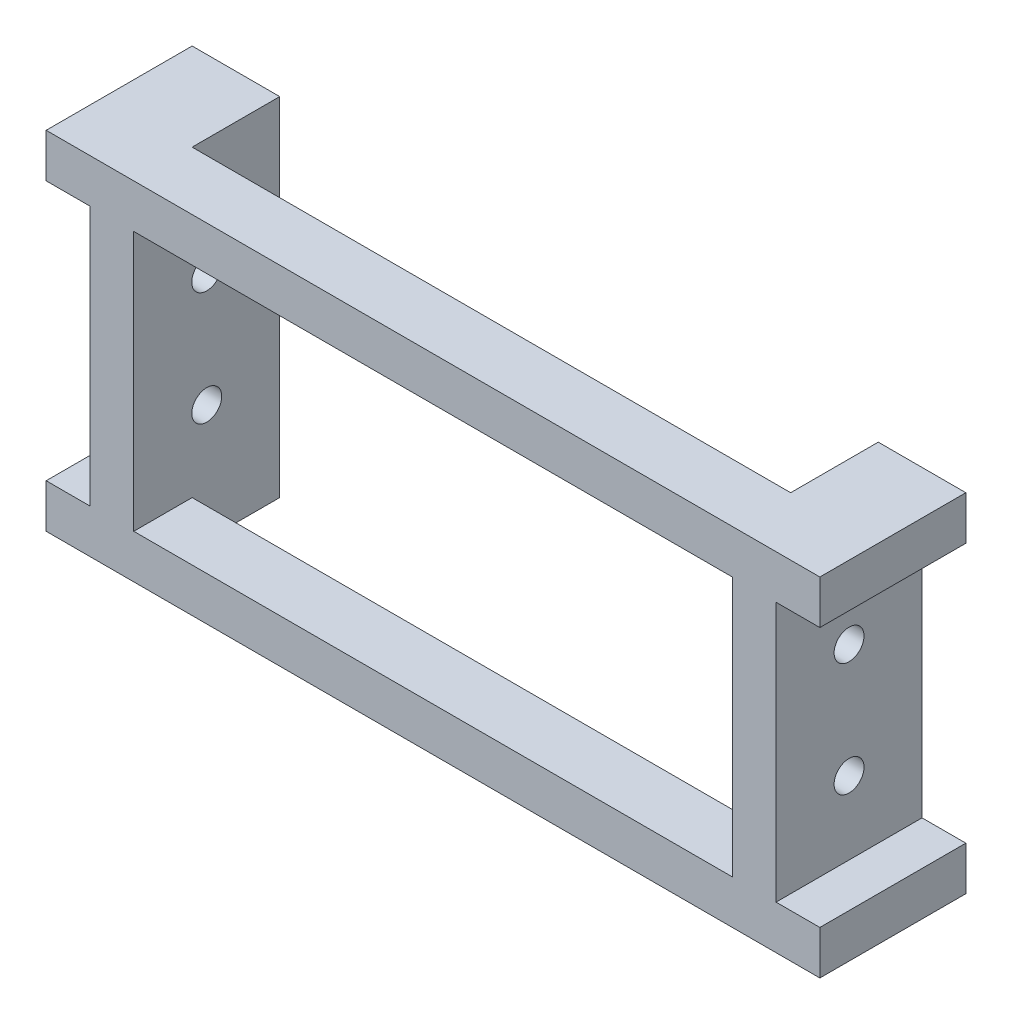
ISO-10303-21;
HEADER;
FILE_DESCRIPTION(('STEP AP214'),'2;1');
FILE_NAME('part.step','',(''),(''),'','','');
FILE_SCHEMA(('AUTOMOTIVE_DESIGN { 1 0 10303 214 1 1 1 1 }'));
ENDSEC;
DATA;
#1=APPLICATION_CONTEXT('core data for automotive mechanical design processes');
#2=APPLICATION_PROTOCOL_DEFINITION('international standard','automotive_design',2000,#1);
#3=PRODUCT_CONTEXT('',#1,'mechanical');
#4=PRODUCT('Part','Part','',(#3));
#5=PRODUCT_RELATED_PRODUCT_CATEGORY('part','',(#4));
#6=PRODUCT_DEFINITION_FORMATION('','',#4);
#7=PRODUCT_DEFINITION_CONTEXT('part definition',#1,'design');
#8=PRODUCT_DEFINITION('design','',#6,#7);
#9=PRODUCT_DEFINITION_SHAPE('','',#8);
#10=(LENGTH_UNIT() NAMED_UNIT(*) SI_UNIT(.MILLI.,.METRE.));
#11=(NAMED_UNIT(*) PLANE_ANGLE_UNIT() SI_UNIT($,.RADIAN.));
#12=(NAMED_UNIT(*) SI_UNIT($,.STERADIAN.) SOLID_ANGLE_UNIT());
#13=UNCERTAINTY_MEASURE_WITH_UNIT(LENGTH_MEASURE(1.E-05),#10,'distance_accuracy_value','');
#14=(GEOMETRIC_REPRESENTATION_CONTEXT(3) GLOBAL_UNCERTAINTY_ASSIGNED_CONTEXT((#13)) GLOBAL_UNIT_ASSIGNED_CONTEXT((#10,
#11,#12)) REPRESENTATION_CONTEXT('',''));
#15=CARTESIAN_POINT('',(0.,0.,0.));
#16=DIRECTION('',(0.,0.,1.));
#17=DIRECTION('',(1.,0.,0.));
#18=AXIS2_PLACEMENT_3D('',#15,#16,#17);
#19=CARTESIAN_POINT('',(-37.7183154819464,9.55195891387468,0.));
#20=DIRECTION('',(0.,0.,1.));
#21=DIRECTION('',(1.,0.,0.));
#22=AXIS2_PLACEMENT_3D('',#19,#20,#21);
#23=PLANE('',#22);
#24=DIRECTION('',(-1.,0.,0.));
#25=VECTOR('',#24,1.);
#26=CARTESIAN_POINT('',(-37.7183154819464,12.5519589138747,0.));
#27=LINE('',#26,#25);
#28=CARTESIAN_POINT('',(-31.7183154819464,12.5519589138747,0.));
#29=VERTEX_POINT('',#28);
#30=CARTESIAN_POINT('',(-37.7183154819464,12.5519589138747,0.));
#31=VERTEX_POINT('',#30);
#32=EDGE_CURVE('E314',#29,#31,#27,.T.);
#33=ORIENTED_EDGE('',*,*,#32,.F.);
#34=DIRECTION('',(0.,-1.,0.));
#35=VECTOR('',#34,1.);
#36=CARTESIAN_POINT('',(-31.7183154819464,9.55195891387468,0.));
#37=LINE('',#36,#35);
#38=CARTESIAN_POINT('',(-31.7183154819464,-11.2380410861253,0.));
#39=VERTEX_POINT('',#38);
#40=EDGE_CURVE('E182',#29,#39,#37,.T.);
#41=ORIENTED_EDGE('',*,*,#40,.T.);
#42=DIRECTION('',(1.,0.,0.));
#43=VECTOR('',#42,1.);
#44=CARTESIAN_POINT('',(-37.7183154819464,-11.2380410861253,0.));
#45=LINE('',#44,#43);
#46=CARTESIAN_POINT('',(-37.7183154819464,-11.2380410861253,0.));
#47=VERTEX_POINT('',#46);
#48=EDGE_CURVE('E301',#47,#39,#45,.T.);
#49=ORIENTED_EDGE('',*,*,#48,.F.);
#50=DIRECTION('',(0.,-1.,0.));
#51=VECTOR('',#50,1.);
#52=CARTESIAN_POINT('',(-37.7183154819464,-8.23804108612532,0.));
#53=LINE('',#52,#51);
#54=CARTESIAN_POINT('',(-37.7183154819464,-8.23804108612532,0.));
#55=VERTEX_POINT('',#54);
#56=EDGE_CURVE('E298',#55,#47,#53,.T.);
#57=ORIENTED_EDGE('',*,*,#56,.F.);
#58=DIRECTION('',(-1.,0.,0.));
#59=VECTOR('',#58,1.);
#60=CARTESIAN_POINT('',(-37.7183154819464,-8.23804108612532,0.));
#61=LINE('',#60,#59);
#62=CARTESIAN_POINT('',(-34.7183154819464,-8.23804108612532,0.));
#63=VERTEX_POINT('',#62);
#64=EDGE_CURVE('E296',#63,#55,#61,.T.);
#65=ORIENTED_EDGE('',*,*,#64,.F.);
#66=DIRECTION('',(0.,-1.,0.));
#67=VECTOR('',#66,1.);
#68=CARTESIAN_POINT('',(-34.7183154819464,9.55195891387468,0.));
#69=LINE('',#68,#67);
#70=CARTESIAN_POINT('',(-34.7183154819464,9.55195891387468,0.));
#71=VERTEX_POINT('',#70);
#72=EDGE_CURVE('E294',#71,#63,#69,.T.);
#73=ORIENTED_EDGE('',*,*,#72,.F.);
#74=DIRECTION('',(1.,0.,0.));
#75=VECTOR('',#74,1.);
#76=CARTESIAN_POINT('',(-37.7183154819464,9.55195891387468,0.));
#77=LINE('',#76,#75);
#78=CARTESIAN_POINT('',(-37.7183154819464,9.55195891387468,0.));
#79=VERTEX_POINT('',#78);
#80=EDGE_CURVE('E292',#79,#71,#77,.T.);
#81=ORIENTED_EDGE('',*,*,#80,.F.);
#82=DIRECTION('',(0.,-1.,0.));
#83=VECTOR('',#82,1.);
#84=CARTESIAN_POINT('',(-37.7183154819464,12.5519589138747,0.));
#85=LINE('',#84,#83);
#86=EDGE_CURVE('E262',#31,#79,#85,.T.);
#87=ORIENTED_EDGE('',*,*,#86,.F.);
#88=EDGE_LOOP('',(#33,#41,#49,#57,#65,#73,#81,#87));
#89=FACE_BOUND('',#88,.T.);
#90=ADVANCED_FACE('F37',(#89),#23,.F.);
#91=DIRECTION('',(0.,1.,0.));
#92=VECTOR('',#91,1.);
#93=CARTESIAN_POINT('',(9.28168451805363,9.55195891387468,0.));
#94=LINE('',#93,#92);
#95=CARTESIAN_POINT('',(9.28168451805363,-11.2380410861253,0.));
#96=VERTEX_POINT('',#95);
#97=CARTESIAN_POINT('',(9.28168451805363,12.5519589138747,0.));
#98=VERTEX_POINT('',#97);
#99=EDGE_CURVE('E245',#96,#98,#94,.T.);
#100=ORIENTED_EDGE('',*,*,#99,.T.);
#101=CARTESIAN_POINT('',(15.2816845180536,12.5519589138747,0.));
#102=VERTEX_POINT('',#101);
#103=EDGE_CURVE('E267',#102,#98,#27,.T.);
#104=ORIENTED_EDGE('',*,*,#103,.F.);
#105=DIRECTION('',(0.,1.,0.));
#106=VECTOR('',#105,1.);
#107=CARTESIAN_POINT('',(15.2816845180536,9.55195891387468,0.));
#108=LINE('',#107,#106);
#109=CARTESIAN_POINT('',(15.2816845180536,9.55195891387468,0.));
#110=VERTEX_POINT('',#109);
#111=EDGE_CURVE('E312',#110,#102,#108,.T.);
#112=ORIENTED_EDGE('',*,*,#111,.F.);
#113=DIRECTION('',(1.,0.,0.));
#114=VECTOR('',#113,1.);
#115=CARTESIAN_POINT('',(12.2816845180536,9.55195891387468,0.));
#116=LINE('',#115,#114);
#117=CARTESIAN_POINT('',(12.2816845180536,9.55195891387468,0.));
#118=VERTEX_POINT('',#117);
#119=EDGE_CURVE('E310',#118,#110,#116,.T.);
#120=ORIENTED_EDGE('',*,*,#119,.F.);
#121=DIRECTION('',(0.,1.,0.));
#122=VECTOR('',#121,1.);
#123=CARTESIAN_POINT('',(12.2816845180536,9.55195891387468,0.));
#124=LINE('',#123,#122);
#125=CARTESIAN_POINT('',(12.2816845180536,-8.23804108612532,0.));
#126=VERTEX_POINT('',#125);
#127=EDGE_CURVE('E308',#126,#118,#124,.T.);
#128=ORIENTED_EDGE('',*,*,#127,.F.);
#129=DIRECTION('',(-1.,0.,0.));
#130=VECTOR('',#129,1.);
#131=CARTESIAN_POINT('',(15.2816845180536,-8.23804108612532,0.));
#132=LINE('',#131,#130);
#133=CARTESIAN_POINT('',(15.2816845180536,-8.23804108612532,0.));
#134=VERTEX_POINT('',#133);
#135=EDGE_CURVE('E306',#134,#126,#132,.T.);
#136=ORIENTED_EDGE('',*,*,#135,.F.);
#137=DIRECTION('',(0.,1.,0.));
#138=VECTOR('',#137,1.);
#139=CARTESIAN_POINT('',(15.2816845180536,-8.23804108612532,0.));
#140=LINE('',#139,#138);
#141=CARTESIAN_POINT('',(15.2816845180536,-11.2380410861253,0.));
#142=VERTEX_POINT('',#141);
#143=EDGE_CURVE('E304',#142,#134,#140,.T.);
#144=ORIENTED_EDGE('',*,*,#143,.F.);
#145=EDGE_CURVE('E300',#96,#142,#45,.T.);
#146=ORIENTED_EDGE('',*,*,#145,.F.);
#147=EDGE_LOOP('',(#100,#104,#112,#120,#128,#136,#144,#146));
#148=FACE_BOUND('',#147,.T.);
#149=ADVANCED_FACE('F386',(#148),#23,.F.);
#150=CARTESIAN_POINT('',(-37.7183154819464,12.5519589138747,10.));
#151=DIRECTION('',(0.,-1.,0.));
#152=DIRECTION('',(0.,0.,-1.));
#153=AXIS2_PLACEMENT_3D('',#150,#151,#152);
#154=PLANE('',#153);
#155=DIRECTION('',(0.,0.,-1.));
#156=VECTOR('',#155,1.);
#157=CARTESIAN_POINT('',(-31.7183154819464,12.5519589138747,6.));
#158=LINE('',#157,#156);
#159=CARTESIAN_POINT('',(-31.7183154819464,12.5519589138747,6.));
#160=VERTEX_POINT('',#159);
#161=EDGE_CURVE('E175',#160,#29,#158,.T.);
#162=ORIENTED_EDGE('',*,*,#161,.T.);
#163=ORIENTED_EDGE('',*,*,#32,.T.);
#164=DIRECTION('',(0.,0.,-1.));
#165=VECTOR('',#164,1.);
#166=CARTESIAN_POINT('',(-37.7183154819464,12.5519589138747,10.));
#167=LINE('',#166,#165);
#168=CARTESIAN_POINT('',(-37.7183154819464,12.5519589138747,10.));
#169=VERTEX_POINT('',#168);
#170=EDGE_CURVE('E289',#169,#31,#167,.T.);
#171=ORIENTED_EDGE('',*,*,#170,.F.);
#172=DIRECTION('',(-1.,0.,0.));
#173=VECTOR('',#172,1.);
#174=CARTESIAN_POINT('',(-37.7183154819464,12.5519589138747,10.));
#175=LINE('',#174,#173);
#176=CARTESIAN_POINT('',(15.2816845180536,12.5519589138747,10.));
#177=VERTEX_POINT('',#176);
#178=EDGE_CURVE('E287',#177,#169,#175,.T.);
#179=ORIENTED_EDGE('',*,*,#178,.F.);
#180=DIRECTION('',(0.,0.,-1.));
#181=VECTOR('',#180,1.);
#182=CARTESIAN_POINT('',(15.2816845180536,12.5519589138747,10.));
#183=LINE('',#182,#181);
#184=EDGE_CURVE('E318',#177,#102,#183,.T.);
#185=ORIENTED_EDGE('',*,*,#184,.T.);
#186=ORIENTED_EDGE('',*,*,#103,.T.);
#187=DIRECTION('',(0.,0.,-1.));
#188=VECTOR('',#187,1.);
#189=CARTESIAN_POINT('',(9.28168451805363,12.5519589138747,6.));
#190=LINE('',#189,#188);
#191=CARTESIAN_POINT('',(9.28168451805363,12.5519589138747,6.));
#192=VERTEX_POINT('',#191);
#193=EDGE_CURVE('E186',#192,#98,#190,.T.);
#194=ORIENTED_EDGE('',*,*,#193,.F.);
#195=DIRECTION('',(-1.,0.,0.));
#196=VECTOR('',#195,1.);
#197=CARTESIAN_POINT('',(-31.7183154819464,12.5519589138747,6.));
#198=LINE('',#197,#196);
#199=EDGE_CURVE('E192',#192,#160,#198,.T.);
#200=ORIENTED_EDGE('',*,*,#199,.T.);
#201=EDGE_LOOP('',(#162,#163,#171,#179,#185,#186,#194,#200));
#202=FACE_BOUND('',#201,.T.);
#203=ADVANCED_FACE('F196',(#202),#154,.F.);
#204=CARTESIAN_POINT('',(-37.7183154819464,9.55195891387468,10.));
#205=DIRECTION('',(0.,0.,1.));
#206=DIRECTION('',(1.,0.,0.));
#207=AXIS2_PLACEMENT_3D('',#204,#205,#206);
#208=PLANE('',#207);
#209=DIRECTION('',(0.,-1.,0.));
#210=VECTOR('',#209,1.);
#211=CARTESIAN_POINT('',(-37.7183154819464,12.5519589138747,10.));
#212=LINE('',#211,#210);
#213=CARTESIAN_POINT('',(-37.7183154819464,9.55195891387468,10.));
#214=VERTEX_POINT('',#213);
#215=EDGE_CURVE('E263',#169,#214,#212,.T.);
#216=ORIENTED_EDGE('',*,*,#215,.T.);
#217=DIRECTION('',(1.,0.,0.));
#218=VECTOR('',#217,1.);
#219=CARTESIAN_POINT('',(-37.7183154819464,9.55195891387468,10.));
#220=LINE('',#219,#218);
#221=CARTESIAN_POINT('',(-34.7183154819464,9.55195891387468,10.));
#222=VERTEX_POINT('',#221);
#223=EDGE_CURVE('E266',#214,#222,#220,.T.);
#224=ORIENTED_EDGE('',*,*,#223,.T.);
#225=DIRECTION('',(0.,-1.,0.));
#226=VECTOR('',#225,1.);
#227=CARTESIAN_POINT('',(-34.7183154819464,9.55195891387468,10.));
#228=LINE('',#227,#226);
#229=CARTESIAN_POINT('',(-34.7183154819464,-8.23804108612532,10.));
#230=VERTEX_POINT('',#229);
#231=EDGE_CURVE('E269',#222,#230,#228,.T.);
#232=ORIENTED_EDGE('',*,*,#231,.T.);
#233=DIRECTION('',(-1.,0.,0.));
#234=VECTOR('',#233,1.);
#235=CARTESIAN_POINT('',(-37.7183154819464,-8.23804108612532,10.));
#236=LINE('',#235,#234);
#237=CARTESIAN_POINT('',(-37.7183154819464,-8.23804108612532,10.));
#238=VERTEX_POINT('',#237);
#239=EDGE_CURVE('E271',#230,#238,#236,.T.);
#240=ORIENTED_EDGE('',*,*,#239,.T.);
#241=DIRECTION('',(0.,-1.,0.));
#242=VECTOR('',#241,1.);
#243=CARTESIAN_POINT('',(-37.7183154819464,-8.23804108612532,10.));
#244=LINE('',#243,#242);
#245=CARTESIAN_POINT('',(-37.7183154819464,-11.2380410861253,10.));
#246=VERTEX_POINT('',#245);
#247=EDGE_CURVE('E273',#238,#246,#244,.T.);
#248=ORIENTED_EDGE('',*,*,#247,.T.);
#249=DIRECTION('',(1.,0.,0.));
#250=VECTOR('',#249,1.);
#251=CARTESIAN_POINT('',(-37.7183154819464,-11.2380410861253,10.));
#252=LINE('',#251,#250);
#253=CARTESIAN_POINT('',(15.2816845180536,-11.2380410861253,10.));
#254=VERTEX_POINT('',#253);
#255=EDGE_CURVE('E275',#246,#254,#252,.T.);
#256=ORIENTED_EDGE('',*,*,#255,.T.);
#257=DIRECTION('',(0.,1.,0.));
#258=VECTOR('',#257,1.);
#259=CARTESIAN_POINT('',(15.2816845180536,-8.23804108612532,10.));
#260=LINE('',#259,#258);
#261=CARTESIAN_POINT('',(15.2816845180536,-8.23804108612532,10.));
#262=VERTEX_POINT('',#261);
#263=EDGE_CURVE('E277',#254,#262,#260,.T.);
#264=ORIENTED_EDGE('',*,*,#263,.T.);
#265=DIRECTION('',(-1.,0.,0.));
#266=VECTOR('',#265,1.);
#267=CARTESIAN_POINT('',(15.2816845180536,-8.23804108612532,10.));
#268=LINE('',#267,#266);
#269=CARTESIAN_POINT('',(12.2816845180536,-8.23804108612532,10.));
#270=VERTEX_POINT('',#269);
#271=EDGE_CURVE('E279',#262,#270,#268,.T.);
#272=ORIENTED_EDGE('',*,*,#271,.T.);
#273=DIRECTION('',(0.,1.,0.));
#274=VECTOR('',#273,1.);
#275=CARTESIAN_POINT('',(12.2816845180536,9.55195891387468,10.));
#276=LINE('',#275,#274);
#277=CARTESIAN_POINT('',(12.2816845180536,9.55195891387468,10.));
#278=VERTEX_POINT('',#277);
#279=EDGE_CURVE('E281',#270,#278,#276,.T.);
#280=ORIENTED_EDGE('',*,*,#279,.T.);
#281=DIRECTION('',(1.,0.,0.));
#282=VECTOR('',#281,1.);
#283=CARTESIAN_POINT('',(12.2816845180536,9.55195891387468,10.));
#284=LINE('',#283,#282);
#285=CARTESIAN_POINT('',(15.2816845180536,9.55195891387468,10.));
#286=VERTEX_POINT('',#285);
#287=EDGE_CURVE('E283',#278,#286,#284,.T.);
#288=ORIENTED_EDGE('',*,*,#287,.T.);
#289=DIRECTION('',(0.,1.,0.));
#290=VECTOR('',#289,1.);
#291=CARTESIAN_POINT('',(15.2816845180536,9.55195891387468,10.));
#292=LINE('',#291,#290);
#293=EDGE_CURVE('E285',#286,#177,#292,.T.);
#294=ORIENTED_EDGE('',*,*,#293,.T.);
#295=ORIENTED_EDGE('',*,*,#178,.T.);
#296=EDGE_LOOP('',(#216,#224,#232,#240,#248,#256,#264,#272,#280,#288,#294,#295));
#297=FACE_BOUND('',#296,.T.);
#298=DIRECTION('',(0.,-1.,0.));
#299=VECTOR('',#298,1.);
#300=CARTESIAN_POINT('',(-31.7183154819464,9.55195891387468,10.));
#301=LINE('',#300,#299);
#302=CARTESIAN_POINT('',(-31.7183154819464,9.55195891387468,10.));
#303=VERTEX_POINT('',#302);
#304=CARTESIAN_POINT('',(-31.7183154819464,-8.23804108612532,10.));
#305=VERTEX_POINT('',#304);
#306=EDGE_CURVE('E244',#303,#305,#301,.T.);
#307=ORIENTED_EDGE('',*,*,#306,.F.);
#308=DIRECTION('',(-1.,0.,0.));
#309=VECTOR('',#308,1.);
#310=CARTESIAN_POINT('',(-31.7183154819464,9.55195891387468,10.));
#311=LINE('',#310,#309);
#312=CARTESIAN_POINT('',(9.28168451805363,9.55195891387468,10.));
#313=VERTEX_POINT('',#312);
#314=EDGE_CURVE('E242',#313,#303,#311,.T.);
#315=ORIENTED_EDGE('',*,*,#314,.F.);
#316=DIRECTION('',(0.,1.,0.));
#317=VECTOR('',#316,1.);
#318=CARTESIAN_POINT('',(9.28168451805363,9.55195891387468,10.));
#319=LINE('',#318,#317);
#320=CARTESIAN_POINT('',(9.28168451805363,-8.23804108612532,10.));
#321=VERTEX_POINT('',#320);
#322=EDGE_CURVE('E249',#321,#313,#319,.T.);
#323=ORIENTED_EDGE('',*,*,#322,.F.);
#324=DIRECTION('',(1.,0.,0.));
#325=VECTOR('',#324,1.);
#326=CARTESIAN_POINT('',(-31.7183154819464,-8.23804108612532,10.));
#327=LINE('',#326,#325);
#328=EDGE_CURVE('E247',#305,#321,#327,.T.);
#329=ORIENTED_EDGE('',*,*,#328,.F.);
#330=EDGE_LOOP('',(#307,#315,#323,#329));
#331=FACE_BOUND('',#330,.T.);
#332=ADVANCED_FACE('F367',(#297,#331),#208,.T.);
#333=CARTESIAN_POINT('',(-37.7183154819464,12.5519589138747,10.));
#334=DIRECTION('',(1.,0.,0.));
#335=DIRECTION('',(0.,0.,-1.));
#336=AXIS2_PLACEMENT_3D('',#333,#334,#335);
#337=PLANE('',#336);
#338=ORIENTED_EDGE('',*,*,#86,.T.);
#339=DIRECTION('',(0.,0.,-1.));
#340=VECTOR('',#339,1.);
#341=CARTESIAN_POINT('',(-37.7183154819464,9.55195891387468,10.));
#342=LINE('',#341,#340);
#343=EDGE_CURVE('E11',#214,#79,#342,.T.);
#344=ORIENTED_EDGE('',*,*,#343,.F.);
#345=ORIENTED_EDGE('',*,*,#215,.F.);
#346=ORIENTED_EDGE('',*,*,#170,.T.);
#347=EDGE_LOOP('',(#338,#344,#345,#346));
#348=FACE_BOUND('',#347,.T.);
#349=ADVANCED_FACE('F39',(#348),#337,.F.);
#350=CARTESIAN_POINT('',(-37.7183154819464,9.55195891387468,10.));
#351=DIRECTION('',(0.,1.,0.));
#352=DIRECTION('',(0.,0.,1.));
#353=AXIS2_PLACEMENT_3D('',#350,#351,#352);
#354=PLANE('',#353);
#355=ORIENTED_EDGE('',*,*,#80,.T.);
#356=DIRECTION('',(0.,0.,-1.));
#357=VECTOR('',#356,1.);
#358=CARTESIAN_POINT('',(-34.7183154819464,9.55195891387468,10.));
#359=LINE('',#358,#357);
#360=EDGE_CURVE('E45',#222,#71,#359,.T.);
#361=ORIENTED_EDGE('',*,*,#360,.F.);
#362=ORIENTED_EDGE('',*,*,#223,.F.);
#363=ORIENTED_EDGE('',*,*,#343,.T.);
#364=EDGE_LOOP('',(#355,#361,#362,#363));
#365=FACE_BOUND('',#364,.T.);
#366=ADVANCED_FACE('F372',(#365),#354,.F.);
#367=CARTESIAN_POINT('',(-34.7183154819464,9.55195891387468,10.));
#368=DIRECTION('',(1.,0.,0.));
#369=DIRECTION('',(0.,0.,-1.));
#370=AXIS2_PLACEMENT_3D('',#367,#368,#369);
#371=PLANE('',#370);
#372=CARTESIAN_POINT('',(-34.7183154819464,4.55195891387468,5.));
#373=DIRECTION('',(-1.,0.,0.));
#374=DIRECTION('',(0.,0.,1.));
#375=AXIS2_PLACEMENT_3D('',#372,#373,#374);
#376=CIRCLE('',#375,1.025);
#377=CARTESIAN_POINT('',(-34.7183154819464,4.55195891387468,6.025));
#378=VERTEX_POINT('',#377);
#379=EDGE_CURVE('E230',#378,#378,#376,.T.);
#380=ORIENTED_EDGE('',*,*,#379,.F.);
#381=EDGE_LOOP('',(#380));
#382=FACE_BOUND('',#381,.T.);
#383=CARTESIAN_POINT('',(-34.7183154819464,-3.23804108612532,5.));
#384=DIRECTION('',(-1.,0.,0.));
#385=DIRECTION('',(0.,0.,1.));
#386=AXIS2_PLACEMENT_3D('',#383,#384,#385);
#387=CIRCLE('',#386,1.025);
#388=CARTESIAN_POINT('',(-34.7183154819464,-3.23804108612532,6.025));
#389=VERTEX_POINT('',#388);
#390=EDGE_CURVE('E236',#389,#389,#387,.T.);
#391=ORIENTED_EDGE('',*,*,#390,.F.);
#392=EDGE_LOOP('',(#391));
#393=FACE_BOUND('',#392,.T.);
#394=ORIENTED_EDGE('',*,*,#72,.T.);
#395=DIRECTION('',(0.,0.,-1.));
#396=VECTOR('',#395,1.);
#397=CARTESIAN_POINT('',(-34.7183154819464,-8.23804108612532,10.));
#398=LINE('',#397,#396);
#399=EDGE_CURVE('E342',#230,#63,#398,.T.);
#400=ORIENTED_EDGE('',*,*,#399,.F.);
#401=ORIENTED_EDGE('',*,*,#231,.F.);
#402=ORIENTED_EDGE('',*,*,#360,.T.);
#403=EDGE_LOOP('',(#394,#400,#401,#402));
#404=FACE_BOUND('',#403,.T.);
#405=ADVANCED_FACE('F349',(#382,#393,#404),#371,.F.);
#406=CARTESIAN_POINT('',(-37.7183154819464,-8.23804108612532,10.));
#407=DIRECTION('',(0.,-1.,0.));
#408=DIRECTION('',(0.,0.,-1.));
#409=AXIS2_PLACEMENT_3D('',#406,#407,#408);
#410=PLANE('',#409);
#411=ORIENTED_EDGE('',*,*,#64,.T.);
#412=DIRECTION('',(0.,0.,-1.));
#413=VECTOR('',#412,1.);
#414=CARTESIAN_POINT('',(-37.7183154819464,-8.23804108612532,10.));
#415=LINE('',#414,#413);
#416=EDGE_CURVE('E339',#238,#55,#415,.T.);
#417=ORIENTED_EDGE('',*,*,#416,.F.);
#418=ORIENTED_EDGE('',*,*,#239,.F.);
#419=ORIENTED_EDGE('',*,*,#399,.T.);
#420=EDGE_LOOP('',(#411,#417,#418,#419));
#421=FACE_BOUND('',#420,.T.);
#422=ADVANCED_FACE('F359',(#421),#410,.F.);
#423=CARTESIAN_POINT('',(-37.7183154819464,-8.23804108612532,10.));
#424=DIRECTION('',(1.,0.,0.));
#425=DIRECTION('',(0.,0.,-1.));
#426=AXIS2_PLACEMENT_3D('',#423,#424,#425);
#427=PLANE('',#426);
#428=ORIENTED_EDGE('',*,*,#56,.T.);
#429=DIRECTION('',(0.,0.,-1.));
#430=VECTOR('',#429,1.);
#431=CARTESIAN_POINT('',(-37.7183154819464,-11.2380410861253,10.));
#432=LINE('',#431,#430);
#433=EDGE_CURVE('E336',#246,#47,#432,.T.);
#434=ORIENTED_EDGE('',*,*,#433,.F.);
#435=ORIENTED_EDGE('',*,*,#247,.F.);
#436=ORIENTED_EDGE('',*,*,#416,.T.);
#437=EDGE_LOOP('',(#428,#434,#435,#436));
#438=FACE_BOUND('',#437,.T.);
#439=ADVANCED_FACE('F363',(#438),#427,.F.);
#440=CARTESIAN_POINT('',(-37.7183154819464,-11.2380410861253,10.));
#441=DIRECTION('',(0.,1.,0.));
#442=DIRECTION('',(0.,0.,1.));
#443=AXIS2_PLACEMENT_3D('',#440,#441,#442);
#444=PLANE('',#443);
#445=ORIENTED_EDGE('',*,*,#48,.T.);
#446=DIRECTION('',(0.,0.,-1.));
#447=VECTOR('',#446,1.);
#448=CARTESIAN_POINT('',(-31.7183154819464,-11.2380410861253,6.));
#449=LINE('',#448,#447);
#450=CARTESIAN_POINT('',(-31.7183154819464,-11.2380410861253,6.));
#451=VERTEX_POINT('',#450);
#452=EDGE_CURVE('E214',#451,#39,#449,.T.);
#453=ORIENTED_EDGE('',*,*,#452,.F.);
#454=DIRECTION('',(-1.,0.,0.));
#455=VECTOR('',#454,1.);
#456=CARTESIAN_POINT('',(-31.7183154819464,-11.2380410861253,6.));
#457=LINE('',#456,#455);
#458=CARTESIAN_POINT('',(9.28168451805363,-11.2380410861253,6.));
#459=VERTEX_POINT('',#458);
#460=EDGE_CURVE('E210',#459,#451,#457,.T.);
#461=ORIENTED_EDGE('',*,*,#460,.F.);
#462=DIRECTION('',(0.,0.,-1.));
#463=VECTOR('',#462,1.);
#464=CARTESIAN_POINT('',(9.28168451805363,-11.2380410861253,6.));
#465=LINE('',#464,#463);
#466=EDGE_CURVE('E213',#459,#96,#465,.T.);
#467=ORIENTED_EDGE('',*,*,#466,.T.);
#468=ORIENTED_EDGE('',*,*,#145,.T.);
#469=DIRECTION('',(0.,0.,-1.));
#470=VECTOR('',#469,1.);
#471=CARTESIAN_POINT('',(15.2816845180536,-11.2380410861253,10.));
#472=LINE('',#471,#470);
#473=EDGE_CURVE('E333',#254,#142,#472,.T.);
#474=ORIENTED_EDGE('',*,*,#473,.F.);
#475=ORIENTED_EDGE('',*,*,#255,.F.);
#476=ORIENTED_EDGE('',*,*,#433,.T.);
#477=EDGE_LOOP('',(#445,#453,#461,#467,#468,#474,#475,#476));
#478=FACE_BOUND('',#477,.T.);
#479=ADVANCED_FACE('F405',(#478),#444,.F.);
#480=CARTESIAN_POINT('',(15.2816845180536,-8.23804108612532,10.));
#481=DIRECTION('',(-1.,0.,0.));
#482=DIRECTION('',(0.,-1.,0.));
#483=AXIS2_PLACEMENT_3D('',#480,#481,#482);
#484=PLANE('',#483);
#485=ORIENTED_EDGE('',*,*,#143,.T.);
#486=DIRECTION('',(0.,0.,-1.));
#487=VECTOR('',#486,1.);
#488=CARTESIAN_POINT('',(15.2816845180536,-8.23804108612532,10.));
#489=LINE('',#488,#487);
#490=EDGE_CURVE('E330',#262,#134,#489,.T.);
#491=ORIENTED_EDGE('',*,*,#490,.F.);
#492=ORIENTED_EDGE('',*,*,#263,.F.);
#493=ORIENTED_EDGE('',*,*,#473,.T.);
#494=EDGE_LOOP('',(#485,#491,#492,#493));
#495=FACE_BOUND('',#494,.T.);
#496=ADVANCED_FACE('F409',(#495),#484,.F.);
#497=CARTESIAN_POINT('',(15.2816845180536,-8.23804108612532,10.));
#498=DIRECTION('',(0.,-1.,0.));
#499=DIRECTION('',(0.,0.,-1.));
#500=AXIS2_PLACEMENT_3D('',#497,#498,#499);
#501=PLANE('',#500);
#502=ORIENTED_EDGE('',*,*,#135,.T.);
#503=DIRECTION('',(0.,0.,-1.));
#504=VECTOR('',#503,1.);
#505=CARTESIAN_POINT('',(12.2816845180536,-8.23804108612532,10.));
#506=LINE('',#505,#504);
#507=EDGE_CURVE('E327',#270,#126,#506,.T.);
#508=ORIENTED_EDGE('',*,*,#507,.F.);
#509=ORIENTED_EDGE('',*,*,#271,.F.);
#510=ORIENTED_EDGE('',*,*,#490,.T.);
#511=EDGE_LOOP('',(#502,#508,#509,#510));
#512=FACE_BOUND('',#511,.T.);
#513=ADVANCED_FACE('F415',(#512),#501,.F.);
#514=CARTESIAN_POINT('',(12.2816845180536,9.55195891387468,10.));
#515=DIRECTION('',(-1.,0.,0.));
#516=DIRECTION('',(0.,-1.,0.));
#517=AXIS2_PLACEMENT_3D('',#514,#515,#516);
#518=PLANE('',#517);
#519=CARTESIAN_POINT('',(12.2816845180536,4.55195891387469,5.));
#520=DIRECTION('',(1.,0.,0.));
#521=DIRECTION('',(0.,0.,-1.));
#522=AXIS2_PLACEMENT_3D('',#519,#520,#521);
#523=CIRCLE('',#522,1.025);
#524=CARTESIAN_POINT('',(12.2816845180536,4.55195891387469,3.975));
#525=VERTEX_POINT('',#524);
#526=EDGE_CURVE('E216',#525,#525,#523,.T.);
#527=ORIENTED_EDGE('',*,*,#526,.F.);
#528=EDGE_LOOP('',(#527));
#529=FACE_BOUND('',#528,.T.);
#530=CARTESIAN_POINT('',(12.2816845180536,-3.23804108612532,5.));
#531=DIRECTION('',(1.,0.,0.));
#532=DIRECTION('',(0.,0.,-1.));
#533=AXIS2_PLACEMENT_3D('',#530,#531,#532);
#534=CIRCLE('',#533,1.025);
#535=CARTESIAN_POINT('',(12.2816845180536,-3.23804108612532,3.975));
#536=VERTEX_POINT('',#535);
#537=EDGE_CURVE('E224',#536,#536,#534,.T.);
#538=ORIENTED_EDGE('',*,*,#537,.F.);
#539=EDGE_LOOP('',(#538));
#540=FACE_BOUND('',#539,.T.);
#541=ORIENTED_EDGE('',*,*,#127,.T.);
#542=DIRECTION('',(0.,0.,-1.));
#543=VECTOR('',#542,1.);
#544=CARTESIAN_POINT('',(12.2816845180536,9.55195891387468,10.));
#545=LINE('',#544,#543);
#546=EDGE_CURVE('E324',#278,#118,#545,.T.);
#547=ORIENTED_EDGE('',*,*,#546,.F.);
#548=ORIENTED_EDGE('',*,*,#279,.F.);
#549=ORIENTED_EDGE('',*,*,#507,.T.);
#550=EDGE_LOOP('',(#541,#547,#548,#549));
#551=FACE_BOUND('',#550,.T.);
#552=ADVANCED_FACE('F418',(#529,#540,#551),#518,.F.);
#553=CARTESIAN_POINT('',(12.2816845180536,9.55195891387468,10.));
#554=DIRECTION('',(0.,1.,0.));
#555=DIRECTION('',(-1.,0.,0.));
#556=AXIS2_PLACEMENT_3D('',#553,#554,#555);
#557=PLANE('',#556);
#558=ORIENTED_EDGE('',*,*,#119,.T.);
#559=DIRECTION('',(0.,0.,-1.));
#560=VECTOR('',#559,1.);
#561=CARTESIAN_POINT('',(15.2816845180536,9.55195891387468,10.));
#562=LINE('',#561,#560);
#563=EDGE_CURVE('E321',#286,#110,#562,.T.);
#564=ORIENTED_EDGE('',*,*,#563,.F.);
#565=ORIENTED_EDGE('',*,*,#287,.F.);
#566=ORIENTED_EDGE('',*,*,#546,.T.);
#567=EDGE_LOOP('',(#558,#564,#565,#566));
#568=FACE_BOUND('',#567,.T.);
#569=ADVANCED_FACE('F420',(#568),#557,.F.);
#570=CARTESIAN_POINT('',(15.2816845180536,9.55195891387468,10.));
#571=DIRECTION('',(-1.,0.,0.));
#572=DIRECTION('',(0.,-1.,0.));
#573=AXIS2_PLACEMENT_3D('',#570,#571,#572);
#574=PLANE('',#573);
#575=ORIENTED_EDGE('',*,*,#111,.T.);
#576=ORIENTED_EDGE('',*,*,#184,.F.);
#577=ORIENTED_EDGE('',*,*,#293,.F.);
#578=ORIENTED_EDGE('',*,*,#563,.T.);
#579=EDGE_LOOP('',(#575,#576,#577,#578));
#580=FACE_BOUND('',#579,.T.);
#581=ADVANCED_FACE('F382',(#580),#574,.F.);
#582=CARTESIAN_POINT('',(-31.7183154819464,9.55195891387468,10.));
#583=DIRECTION('',(0.,-1.,0.));
#584=DIRECTION('',(0.,0.,-1.));
#585=AXIS2_PLACEMENT_3D('',#582,#583,#584);
#586=PLANE('',#585);
#587=DIRECTION('',(1.,0.,0.));
#588=VECTOR('',#587,1.);
#589=CARTESIAN_POINT('',(-31.7183154819464,9.55195891387468,6.));
#590=LINE('',#589,#588);
#591=CARTESIAN_POINT('',(-31.7183154819464,9.55195891387468,6.));
#592=VERTEX_POINT('',#591);
#593=CARTESIAN_POINT('',(9.28168451805363,9.55195891387468,6.));
#594=VERTEX_POINT('',#593);
#595=EDGE_CURVE('E187',#592,#594,#590,.T.);
#596=ORIENTED_EDGE('',*,*,#595,.T.);
#597=DIRECTION('',(0.,0.,-1.));
#598=VECTOR('',#597,1.);
#599=CARTESIAN_POINT('',(9.28168451805363,9.55195891387468,10.));
#600=LINE('',#599,#598);
#601=EDGE_CURVE('E251',#313,#594,#600,.T.);
#602=ORIENTED_EDGE('',*,*,#601,.F.);
#603=ORIENTED_EDGE('',*,*,#314,.T.);
#604=DIRECTION('',(0.,0.,-1.));
#605=VECTOR('',#604,1.);
#606=CARTESIAN_POINT('',(-31.7183154819464,9.55195891387468,10.));
#607=LINE('',#606,#605);
#608=EDGE_CURVE('E260',#303,#592,#607,.T.);
#609=ORIENTED_EDGE('',*,*,#608,.T.);
#610=EDGE_LOOP('',(#596,#602,#603,#609));
#611=FACE_BOUND('',#610,.T.);
#612=ADVANCED_FACE('F393',(#611),#586,.T.);
#613=CARTESIAN_POINT('',(-31.7183154819464,9.55195891387468,10.));
#614=DIRECTION('',(1.,0.,0.));
#615=DIRECTION('',(0.,0.,-1.));
#616=AXIS2_PLACEMENT_3D('',#613,#614,#615);
#617=PLANE('',#616);
#618=CARTESIAN_POINT('',(-31.7183154819464,4.55195891387468,5.));
#619=DIRECTION('',(1.,0.,0.));
#620=DIRECTION('',(0.,0.,-1.));
#621=AXIS2_PLACEMENT_3D('',#618,#619,#620);
#622=CIRCLE('',#621,1.025);
#623=CARTESIAN_POINT('',(-31.7183154819464,4.55195891387468,3.975));
#624=VERTEX_POINT('',#623);
#625=EDGE_CURVE('E233',#624,#624,#622,.T.);
#626=ORIENTED_EDGE('',*,*,#625,.F.);
#627=EDGE_LOOP('',(#626));
#628=FACE_BOUND('',#627,.T.);
#629=CARTESIAN_POINT('',(-31.7183154819464,-3.23804108612532,5.));
#630=DIRECTION('',(1.,0.,0.));
#631=DIRECTION('',(0.,0.,-1.));
#632=AXIS2_PLACEMENT_3D('',#629,#630,#631);
#633=CIRCLE('',#632,1.025);
#634=CARTESIAN_POINT('',(-31.7183154819464,-3.23804108612532,3.975));
#635=VERTEX_POINT('',#634);
#636=EDGE_CURVE('E239',#635,#635,#633,.T.);
#637=ORIENTED_EDGE('',*,*,#636,.F.);
#638=EDGE_LOOP('',(#637));
#639=FACE_BOUND('',#638,.T.);
#640=ORIENTED_EDGE('',*,*,#40,.F.);
#641=ORIENTED_EDGE('',*,*,#161,.F.);
#642=DIRECTION('',(0.,-1.,0.));
#643=VECTOR('',#642,1.);
#644=CARTESIAN_POINT('',(-31.7183154819464,9.55195891387468,6.));
#645=LINE('',#644,#643);
#646=EDGE_CURVE('E179',#160,#592,#645,.T.);
#647=ORIENTED_EDGE('',*,*,#646,.T.);
#648=ORIENTED_EDGE('',*,*,#608,.F.);
#649=ORIENTED_EDGE('',*,*,#306,.T.);
#650=DIRECTION('',(0.,0.,-1.));
#651=VECTOR('',#650,1.);
#652=CARTESIAN_POINT('',(-31.7183154819464,-8.23804108612532,10.));
#653=LINE('',#652,#651);
#654=CARTESIAN_POINT('',(-31.7183154819464,-8.23804108612532,6.));
#655=VERTEX_POINT('',#654);
#656=EDGE_CURVE('E257',#305,#655,#653,.T.);
#657=ORIENTED_EDGE('',*,*,#656,.T.);
#658=DIRECTION('',(0.,1.,0.));
#659=VECTOR('',#658,1.);
#660=CARTESIAN_POINT('',(-31.7183154819464,-8.23804108612532,6.));
#661=LINE('',#660,#659);
#662=EDGE_CURVE('E204',#451,#655,#661,.T.);
#663=ORIENTED_EDGE('',*,*,#662,.F.);
#664=ORIENTED_EDGE('',*,*,#452,.T.);
#665=EDGE_LOOP('',(#640,#641,#647,#648,#649,#657,#663,#664));
#666=FACE_BOUND('',#665,.T.);
#667=ADVANCED_FACE('F177',(#628,#639,#666),#617,.T.);
#668=CARTESIAN_POINT('',(-31.7183154819464,-8.23804108612532,10.));
#669=DIRECTION('',(0.,1.,0.));
#670=DIRECTION('',(0.,0.,1.));
#671=AXIS2_PLACEMENT_3D('',#668,#669,#670);
#672=PLANE('',#671);
#673=DIRECTION('',(1.,0.,0.));
#674=VECTOR('',#673,1.);
#675=CARTESIAN_POINT('',(-31.7183154819464,-8.23804108612532,6.));
#676=LINE('',#675,#674);
#677=CARTESIAN_POINT('',(9.28168451805363,-8.23804108612532,6.));
#678=VERTEX_POINT('',#677);
#679=EDGE_CURVE('E52',#655,#678,#676,.T.);
#680=ORIENTED_EDGE('',*,*,#679,.F.);
#681=ORIENTED_EDGE('',*,*,#656,.F.);
#682=ORIENTED_EDGE('',*,*,#328,.T.);
#683=DIRECTION('',(0.,0.,-1.));
#684=VECTOR('',#683,1.);
#685=CARTESIAN_POINT('',(9.28168451805363,-8.23804108612532,10.));
#686=LINE('',#685,#684);
#687=EDGE_CURVE('E59',#321,#678,#686,.T.);
#688=ORIENTED_EDGE('',*,*,#687,.T.);
#689=EDGE_LOOP('',(#680,#681,#682,#688));
#690=FACE_BOUND('',#689,.T.);
#691=ADVANCED_FACE('F400',(#690),#672,.T.);
#692=CARTESIAN_POINT('',(9.28168451805363,9.55195891387468,10.));
#693=DIRECTION('',(-1.,0.,0.));
#694=DIRECTION('',(0.,0.,1.));
#695=AXIS2_PLACEMENT_3D('',#692,#693,#694);
#696=PLANE('',#695);
#697=CARTESIAN_POINT('',(9.28168451805363,4.55195891387469,5.));
#698=DIRECTION('',(-1.,0.,0.));
#699=DIRECTION('',(0.,0.,1.));
#700=AXIS2_PLACEMENT_3D('',#697,#698,#699);
#701=CIRCLE('',#700,1.025);
#702=CARTESIAN_POINT('',(9.28168451805363,4.55195891387469,6.025));
#703=VERTEX_POINT('',#702);
#704=EDGE_CURVE('E221',#703,#703,#701,.T.);
#705=ORIENTED_EDGE('',*,*,#704,.F.);
#706=EDGE_LOOP('',(#705));
#707=FACE_BOUND('',#706,.T.);
#708=CARTESIAN_POINT('',(9.28168451805363,-3.23804108612532,5.));
#709=DIRECTION('',(-1.,0.,0.));
#710=DIRECTION('',(0.,0.,1.));
#711=AXIS2_PLACEMENT_3D('',#708,#709,#710);
#712=CIRCLE('',#711,1.025);
#713=CARTESIAN_POINT('',(9.28168451805363,-3.23804108612532,6.025));
#714=VERTEX_POINT('',#713);
#715=EDGE_CURVE('E227',#714,#714,#712,.T.);
#716=ORIENTED_EDGE('',*,*,#715,.F.);
#717=EDGE_LOOP('',(#716));
#718=FACE_BOUND('',#717,.T.);
#719=ORIENTED_EDGE('',*,*,#99,.F.);
#720=ORIENTED_EDGE('',*,*,#466,.F.);
#721=DIRECTION('',(0.,-1.,0.));
#722=VECTOR('',#721,1.);
#723=CARTESIAN_POINT('',(9.28168451805363,-8.23804108612532,6.));
#724=LINE('',#723,#722);
#725=EDGE_CURVE('E208',#678,#459,#724,.T.);
#726=ORIENTED_EDGE('',*,*,#725,.F.);
#727=ORIENTED_EDGE('',*,*,#687,.F.);
#728=ORIENTED_EDGE('',*,*,#322,.T.);
#729=ORIENTED_EDGE('',*,*,#601,.T.);
#730=DIRECTION('',(0.,1.,0.));
#731=VECTOR('',#730,1.);
#732=CARTESIAN_POINT('',(9.28168451805363,9.55195891387468,6.));
#733=LINE('',#732,#731);
#734=EDGE_CURVE('E199',#594,#192,#733,.T.);
#735=ORIENTED_EDGE('',*,*,#734,.T.);
#736=ORIENTED_EDGE('',*,*,#193,.T.);
#737=EDGE_LOOP('',(#719,#720,#726,#727,#728,#729,#735,#736));
#738=FACE_BOUND('',#737,.T.);
#739=ADVANCED_FACE('F390',(#707,#718,#738),#696,.T.);
#740=CARTESIAN_POINT('',(-34.7183154819464,-3.23804108612532,5.));
#741=DIRECTION('',(-1.,0.,0.));
#742=DIRECTION('',(0.,0.,1.));
#743=AXIS2_PLACEMENT_3D('',#740,#741,#742);
#744=CYLINDRICAL_SURFACE('',#743,1.025);
#745=ORIENTED_EDGE('',*,*,#636,.T.);
#746=EDGE_LOOP('',(#745));
#747=FACE_BOUND('',#746,.T.);
#748=ORIENTED_EDGE('',*,*,#390,.T.);
#749=EDGE_LOOP('',(#748));
#750=FACE_BOUND('',#749,.T.);
#751=ADVANCED_FACE('F570',(#747,#750),#744,.F.);
#752=CARTESIAN_POINT('',(-34.7183154819464,4.55195891387468,5.));
#753=DIRECTION('',(-1.,0.,0.));
#754=DIRECTION('',(0.,0.,1.));
#755=AXIS2_PLACEMENT_3D('',#752,#753,#754);
#756=CYLINDRICAL_SURFACE('',#755,1.025);
#757=ORIENTED_EDGE('',*,*,#625,.T.);
#758=EDGE_LOOP('',(#757));
#759=FACE_BOUND('',#758,.T.);
#760=ORIENTED_EDGE('',*,*,#379,.T.);
#761=EDGE_LOOP('',(#760));
#762=FACE_BOUND('',#761,.T.);
#763=ADVANCED_FACE('F478',(#759,#762),#756,.F.);
#764=CARTESIAN_POINT('',(12.2816845180536,-3.23804108612532,5.));
#765=DIRECTION('',(1.,0.,0.));
#766=DIRECTION('',(0.,0.,-1.));
#767=AXIS2_PLACEMENT_3D('',#764,#765,#766);
#768=CYLINDRICAL_SURFACE('',#767,1.025);
#769=ORIENTED_EDGE('',*,*,#715,.T.);
#770=EDGE_LOOP('',(#769));
#771=FACE_BOUND('',#770,.T.);
#772=ORIENTED_EDGE('',*,*,#537,.T.);
#773=EDGE_LOOP('',(#772));
#774=FACE_BOUND('',#773,.T.);
#775=ADVANCED_FACE('F483',(#771,#774),#768,.F.);
#776=CARTESIAN_POINT('',(12.2816845180536,4.55195891387469,5.));
#777=DIRECTION('',(1.,0.,0.));
#778=DIRECTION('',(0.,0.,-1.));
#779=AXIS2_PLACEMENT_3D('',#776,#777,#778);
#780=CYLINDRICAL_SURFACE('',#779,1.025);
#781=ORIENTED_EDGE('',*,*,#704,.T.);
#782=EDGE_LOOP('',(#781));
#783=FACE_BOUND('',#782,.T.);
#784=ORIENTED_EDGE('',*,*,#526,.T.);
#785=EDGE_LOOP('',(#784));
#786=FACE_BOUND('',#785,.T.);
#787=ADVANCED_FACE('F489',(#783,#786),#780,.F.);
#788=CARTESIAN_POINT('',(0.,0.,6.));
#789=DIRECTION('',(0.,0.,1.));
#790=DIRECTION('',(1.,0.,0.));
#791=AXIS2_PLACEMENT_3D('',#788,#789,#790);
#792=PLANE('',#791);
#793=ORIENTED_EDGE('',*,*,#662,.T.);
#794=ORIENTED_EDGE('',*,*,#679,.T.);
#795=ORIENTED_EDGE('',*,*,#725,.T.);
#796=ORIENTED_EDGE('',*,*,#460,.T.);
#797=EDGE_LOOP('',(#793,#794,#795,#796));
#798=FACE_BOUND('',#797,.T.);
#799=ADVANCED_FACE('F403',(#798),#792,.F.);
#800=CARTESIAN_POINT('',(0.,1.31391782774936,6.));
#801=DIRECTION('',(0.,0.,1.));
#802=DIRECTION('',(1.,0.,0.));
#803=AXIS2_PLACEMENT_3D('',#800,#801,#802);
#804=PLANE('',#803);
#805=ORIENTED_EDGE('',*,*,#646,.F.);
#806=ORIENTED_EDGE('',*,*,#199,.F.);
#807=ORIENTED_EDGE('',*,*,#734,.F.);
#808=ORIENTED_EDGE('',*,*,#595,.F.);
#809=EDGE_LOOP('',(#805,#806,#807,#808));
#810=FACE_BOUND('',#809,.T.);
#811=ADVANCED_FACE('F191',(#810),#804,.F.);
#812=CLOSED_SHELL('',(#90,#149,#203,#332,#349,#366,#405,#422,#439,#479,#496,#513,#552,#569,#581,
#612,#667,#691,#739,#751,#763,#775,#787,#799,#811));
#813=MANIFOLD_SOLID_BREP('B2',#812);
#814=ADVANCED_BREP_SHAPE_REPRESENTATION('',(#18,#813),#14);
#815=SHAPE_DEFINITION_REPRESENTATION(#9,#814);
ENDSEC;
END-ISO-10303-21;
